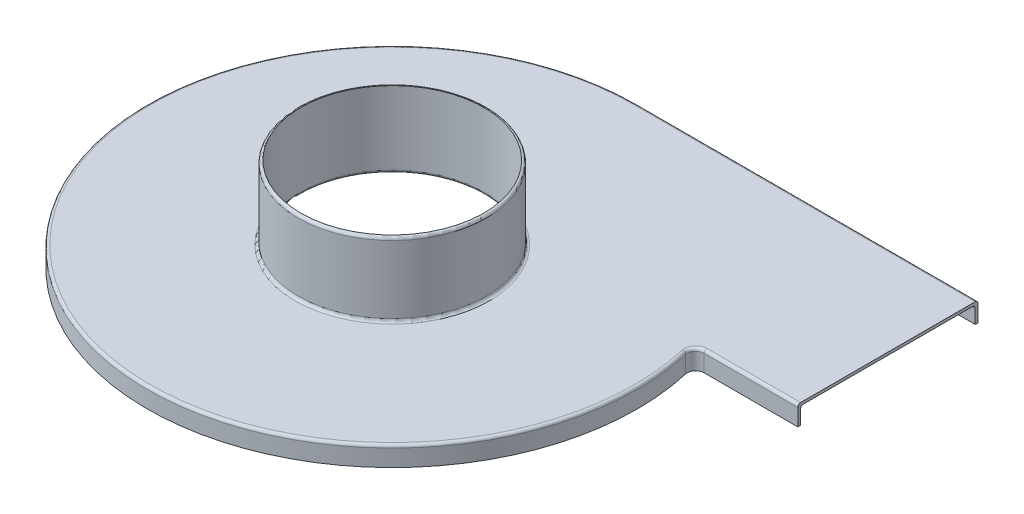
ISO-10303-21;
HEADER;
FILE_DESCRIPTION(('STEP AP214'),'2;1');
FILE_NAME('part.step','',(''),(''),'','','');
FILE_SCHEMA(('AUTOMOTIVE_DESIGN { 1 0 10303 214 1 1 1 1 }'));
ENDSEC;
DATA;
#1=APPLICATION_CONTEXT('core data for automotive mechanical design processes');
#2=APPLICATION_PROTOCOL_DEFINITION('international standard','automotive_design',2000,#1);
#3=PRODUCT_CONTEXT('',#1,'mechanical');
#4=PRODUCT('Part','Part','',(#3));
#5=PRODUCT_RELATED_PRODUCT_CATEGORY('part','',(#4));
#6=PRODUCT_DEFINITION_FORMATION('','',#4);
#7=PRODUCT_DEFINITION_CONTEXT('part definition',#1,'design');
#8=PRODUCT_DEFINITION('design','',#6,#7);
#9=PRODUCT_DEFINITION_SHAPE('','',#8);
#10=(LENGTH_UNIT() NAMED_UNIT(*) SI_UNIT(.MILLI.,.METRE.));
#11=(NAMED_UNIT(*) PLANE_ANGLE_UNIT() SI_UNIT($,.RADIAN.));
#12=(NAMED_UNIT(*) SI_UNIT($,.STERADIAN.) SOLID_ANGLE_UNIT());
#13=UNCERTAINTY_MEASURE_WITH_UNIT(LENGTH_MEASURE(1.E-05),#10,'distance_accuracy_value','');
#14=(GEOMETRIC_REPRESENTATION_CONTEXT(3) GLOBAL_UNCERTAINTY_ASSIGNED_CONTEXT((#13)) GLOBAL_UNIT_ASSIGNED_CONTEXT((#10,
#11,#12)) REPRESENTATION_CONTEXT('',''));
#15=CARTESIAN_POINT('',(0.,0.,0.));
#16=DIRECTION('',(0.,0.,1.));
#17=DIRECTION('',(1.,0.,0.));
#18=AXIS2_PLACEMENT_3D('',#15,#16,#17);
#19=CARTESIAN_POINT('',(121.,1.,0.));
#20=DIRECTION('',(1.,0.,0.));
#21=DIRECTION('',(0.,0.,-1.));
#22=AXIS2_PLACEMENT_3D('',#19,#20,#21);
#23=PLANE('',#22);
#24=DIRECTION('',(0.,-1.,0.));
#25=VECTOR('',#24,1.);
#26=CARTESIAN_POINT('',(121.,1.,-87.));
#27=LINE('',#26,#25);
#28=CARTESIAN_POINT('',(121.,0.,-87.));
#29=VERTEX_POINT('',#28);
#30=CARTESIAN_POINT('',(121.,-6.,-87.));
#31=VERTEX_POINT('',#30);
#32=EDGE_CURVE('E166',#29,#31,#27,.T.);
#33=ORIENTED_EDGE('',*,*,#32,.F.);
#34=CARTESIAN_POINT('',(121.,0.,-86.));
#35=DIRECTION('',(1.,0.,0.));
#36=DIRECTION('',(0.,0.,-1.));
#37=AXIS2_PLACEMENT_3D('',#34,#35,#36);
#38=CIRCLE('',#37,1.);
#39=CARTESIAN_POINT('',(121.,1.,-86.));
#40=VERTEX_POINT('',#39);
#41=EDGE_CURVE('E284',#29,#40,#38,.T.);
#42=ORIENTED_EDGE('',*,*,#41,.T.);
#43=DIRECTION('',(0.,0.,1.));
#44=VECTOR('',#43,1.);
#45=CARTESIAN_POINT('',(121.,1.,0.));
#46=LINE('',#45,#44);
#47=CARTESIAN_POINT('',(121.,1.,-24.));
#48=VERTEX_POINT('',#47);
#49=EDGE_CURVE('E235',#40,#48,#46,.T.);
#50=ORIENTED_EDGE('',*,*,#49,.T.);
#51=CARTESIAN_POINT('',(121.,0.,-24.));
#52=DIRECTION('',(1.,0.,0.));
#53=DIRECTION('',(0.,0.,-1.));
#54=AXIS2_PLACEMENT_3D('',#51,#52,#53);
#55=CIRCLE('',#54,1.);
#56=CARTESIAN_POINT('',(121.,0.,-23.));
#57=VERTEX_POINT('',#56);
#58=EDGE_CURVE('E281',#48,#57,#55,.T.);
#59=ORIENTED_EDGE('',*,*,#58,.T.);
#60=DIRECTION('',(0.,-1.,0.));
#61=VECTOR('',#60,1.);
#62=CARTESIAN_POINT('',(121.,1.,-23.));
#63=LINE('',#62,#61);
#64=CARTESIAN_POINT('',(121.,-6.,-23.));
#65=VERTEX_POINT('',#64);
#66=EDGE_CURVE('E239',#57,#65,#63,.T.);
#67=ORIENTED_EDGE('',*,*,#66,.T.);
#68=DIRECTION('',(0.,0.,1.));
#69=VECTOR('',#68,1.);
#70=CARTESIAN_POINT('',(121.,-6.,0.));
#71=LINE('',#70,#69);
#72=CARTESIAN_POINT('',(121.,-6.,-24.));
#73=VERTEX_POINT('',#72);
#74=EDGE_CURVE('E194',#73,#65,#71,.T.);
#75=ORIENTED_EDGE('',*,*,#74,.F.);
#76=DIRECTION('',(0.,1.,0.));
#77=VECTOR('',#76,1.);
#78=CARTESIAN_POINT('',(121.,-6.,-24.));
#79=LINE('',#78,#77);
#80=CARTESIAN_POINT('',(121.,-1.,-24.));
#81=VERTEX_POINT('',#80);
#82=EDGE_CURVE('E231',#73,#81,#79,.T.);
#83=ORIENTED_EDGE('',*,*,#82,.T.);
#84=CARTESIAN_POINT('',(121.,-1.,-25.));
#85=DIRECTION('',(1.,0.,0.));
#86=DIRECTION('',(0.,0.,-1.));
#87=AXIS2_PLACEMENT_3D('',#84,#85,#86);
#88=CIRCLE('',#87,1.);
#89=CARTESIAN_POINT('',(121.,0.,-25.));
#90=VERTEX_POINT('',#89);
#91=EDGE_CURVE('E11',#81,#90,#88,.F.);
#92=ORIENTED_EDGE('',*,*,#91,.T.);
#93=DIRECTION('',(0.,0.,1.));
#94=VECTOR('',#93,1.);
#95=CARTESIAN_POINT('',(121.,0.,0.));
#96=LINE('',#95,#94);
#97=CARTESIAN_POINT('',(121.,0.,-85.));
#98=VERTEX_POINT('',#97);
#99=EDGE_CURVE('E218',#98,#90,#96,.T.);
#100=ORIENTED_EDGE('',*,*,#99,.F.);
#101=CARTESIAN_POINT('',(121.,-1.,-85.));
#102=DIRECTION('',(1.,0.,0.));
#103=DIRECTION('',(0.,0.,-1.));
#104=AXIS2_PLACEMENT_3D('',#101,#102,#103);
#105=CIRCLE('',#104,1.);
#106=CARTESIAN_POINT('',(121.,-1.,-86.));
#107=VERTEX_POINT('',#106);
#108=EDGE_CURVE('E55',#98,#107,#105,.F.);
#109=ORIENTED_EDGE('',*,*,#108,.T.);
#110=DIRECTION('',(0.,1.,0.));
#111=VECTOR('',#110,1.);
#112=CARTESIAN_POINT('',(121.,-6.,-86.));
#113=LINE('',#112,#111);
#114=CARTESIAN_POINT('',(121.,-6.,-86.));
#115=VERTEX_POINT('',#114);
#116=EDGE_CURVE('E214',#115,#107,#113,.T.);
#117=ORIENTED_EDGE('',*,*,#116,.F.);
#118=EDGE_CURVE('E199',#31,#115,#71,.T.);
#119=ORIENTED_EDGE('',*,*,#118,.F.);
#120=EDGE_LOOP('',(#33,#42,#50,#59,#67,#75,#83,#92,#100,#109,#117,#119));
#121=FACE_BOUND('',#120,.T.);
#122=ADVANCED_FACE('F45',(#121),#23,.T.);
#123=CARTESIAN_POINT('',(0.,1.,-87.));
#124=DIRECTION('',(0.,0.,-1.));
#125=DIRECTION('',(-1.,0.,0.));
#126=AXIS2_PLACEMENT_3D('',#123,#124,#125);
#127=PLANE('',#126);
#128=DIRECTION('',(0.,-1.,0.));
#129=VECTOR('',#128,1.);
#130=CARTESIAN_POINT('',(0.,1.,-87.));
#131=LINE('',#130,#129);
#132=CARTESIAN_POINT('',(0.,0.,-87.));
#133=VERTEX_POINT('',#132);
#134=CARTESIAN_POINT('',(0.,-6.,-87.));
#135=VERTEX_POINT('',#134);
#136=EDGE_CURVE('E155',#133,#135,#131,.T.);
#137=ORIENTED_EDGE('',*,*,#136,.F.);
#138=DIRECTION('',(1.,0.,0.));
#139=VECTOR('',#138,1.);
#140=CARTESIAN_POINT('',(0.,0.,-87.));
#141=LINE('',#140,#139);
#142=EDGE_CURVE('E278',#133,#29,#141,.T.);
#143=ORIENTED_EDGE('',*,*,#142,.T.);
#144=ORIENTED_EDGE('',*,*,#32,.T.);
#145=DIRECTION('',(1.,0.,0.));
#146=VECTOR('',#145,1.);
#147=CARTESIAN_POINT('',(0.,-6.,-87.));
#148=LINE('',#147,#146);
#149=EDGE_CURVE('E170',#135,#31,#148,.T.);
#150=ORIENTED_EDGE('',*,*,#149,.F.);
#151=EDGE_LOOP('',(#137,#143,#144,#150));
#152=FACE_BOUND('',#151,.T.);
#153=ADVANCED_FACE('F171',(#152),#127,.T.);
#154=CARTESIAN_POINT('',(0.,1.,0.));
#155=DIRECTION('',(0.,-1.,0.));
#156=DIRECTION('',(0.,0.,-1.));
#157=AXIS2_PLACEMENT_3D('',#154,#155,#156);
#158=CYLINDRICAL_SURFACE('',#157,87.);
#159=DIRECTION('',(0.,-1.,0.));
#160=VECTOR('',#159,1.);
#161=CARTESIAN_POINT('',(84.8246557447905,1.,-19.3333333333333));
#162=LINE('',#161,#160);
#163=CARTESIAN_POINT('',(84.8246557447905,0.,-19.3333333333333));
#164=VERTEX_POINT('',#163);
#165=CARTESIAN_POINT('',(84.8246557447905,-6.,-19.3333333333333));
#166=VERTEX_POINT('',#165);
#167=EDGE_CURVE('E167',#164,#166,#162,.T.);
#168=ORIENTED_EDGE('',*,*,#167,.F.);
#169=CARTESIAN_POINT('',(0.,0.,0.));
#170=DIRECTION('',(0.,1.,0.));
#171=DIRECTION('',(0.,0.,1.));
#172=AXIS2_PLACEMENT_3D('',#169,#170,#171);
#173=CIRCLE('',#172,87.);
#174=EDGE_CURVE('E161',#164,#133,#173,.F.);
#175=ORIENTED_EDGE('',*,*,#174,.T.);
#176=ORIENTED_EDGE('',*,*,#136,.T.);
#177=CARTESIAN_POINT('',(0.,-6.,0.));
#178=DIRECTION('',(0.,1.,0.));
#179=DIRECTION('',(0.,0.,1.));
#180=AXIS2_PLACEMENT_3D('',#177,#178,#179);
#181=CIRCLE('',#180,87.);
#182=EDGE_CURVE('E159',#135,#166,#181,.T.);
#183=ORIENTED_EDGE('',*,*,#182,.T.);
#184=EDGE_LOOP('',(#168,#175,#176,#183));
#185=FACE_BOUND('',#184,.T.);
#186=ADVANCED_FACE('F157',(#185),#158,.T.);
#187=CARTESIAN_POINT('',(87.7496438739212,1.,-20.));
#188=DIRECTION('',(0.,-1.,0.));
#189=DIRECTION('',(0.,0.,-1.));
#190=AXIS2_PLACEMENT_3D('',#187,#188,#189);
#191=CYLINDRICAL_SURFACE('',#190,3.);
#192=DIRECTION('',(0.,-1.,0.));
#193=VECTOR('',#192,1.);
#194=CARTESIAN_POINT('',(87.7496438739212,1.,-23.));
#195=LINE('',#194,#193);
#196=CARTESIAN_POINT('',(87.7496438739212,0.,-23.));
#197=VERTEX_POINT('',#196);
#198=CARTESIAN_POINT('',(87.7496438739212,-6.,-23.));
#199=VERTEX_POINT('',#198);
#200=EDGE_CURVE('E245',#197,#199,#195,.T.);
#201=ORIENTED_EDGE('',*,*,#200,.F.);
#202=CARTESIAN_POINT('',(87.7496438739212,0.,-20.));
#203=DIRECTION('',(0.,1.,0.));
#204=DIRECTION('',(0.,0.,1.));
#205=AXIS2_PLACEMENT_3D('',#202,#203,#204);
#206=CIRCLE('',#205,3.);
#207=EDGE_CURVE('E63',#197,#164,#206,.T.);
#208=ORIENTED_EDGE('',*,*,#207,.T.);
#209=ORIENTED_EDGE('',*,*,#167,.T.);
#210=CARTESIAN_POINT('',(87.7496438739212,-6.,-20.));
#211=DIRECTION('',(0.,1.,0.));
#212=DIRECTION('',(0.,0.,1.));
#213=AXIS2_PLACEMENT_3D('',#210,#211,#212);
#214=CIRCLE('',#213,3.);
#215=EDGE_CURVE('E182',#199,#166,#214,.T.);
#216=ORIENTED_EDGE('',*,*,#215,.F.);
#217=EDGE_LOOP('',(#201,#208,#209,#216));
#218=FACE_BOUND('',#217,.T.);
#219=ADVANCED_FACE('F576',(#218),#191,.F.);
#220=CARTESIAN_POINT('',(0.,1.,-23.));
#221=DIRECTION('',(0.,0.,1.));
#222=DIRECTION('',(1.,0.,0.));
#223=AXIS2_PLACEMENT_3D('',#220,#221,#222);
#224=PLANE('',#223);
#225=ORIENTED_EDGE('',*,*,#66,.F.);
#226=DIRECTION('',(-1.,0.,0.));
#227=VECTOR('',#226,1.);
#228=CARTESIAN_POINT('',(0.,0.,-23.));
#229=LINE('',#228,#227);
#230=EDGE_CURVE('E71',#57,#197,#229,.T.);
#231=ORIENTED_EDGE('',*,*,#230,.T.);
#232=ORIENTED_EDGE('',*,*,#200,.T.);
#233=DIRECTION('',(-1.,0.,0.));
#234=VECTOR('',#233,1.);
#235=CARTESIAN_POINT('',(0.,-6.,-23.));
#236=LINE('',#235,#234);
#237=EDGE_CURVE('E188',#65,#199,#236,.T.);
#238=ORIENTED_EDGE('',*,*,#237,.F.);
#239=EDGE_LOOP('',(#225,#231,#232,#238));
#240=FACE_BOUND('',#239,.T.);
#241=ADVANCED_FACE('F570',(#240),#224,.T.);
#242=CARTESIAN_POINT('',(0.,1.,0.));
#243=DIRECTION('',(0.,1.,0.));
#244=DIRECTION('',(0.,0.,1.));
#245=AXIS2_PLACEMENT_3D('',#242,#243,#244);
#246=PLANE('',#245);
#247=ORIENTED_EDGE('',*,*,#49,.F.);
#248=DIRECTION('',(1.,0.,0.));
#249=VECTOR('',#248,1.);
#250=CARTESIAN_POINT('',(0.,1.,-86.));
#251=LINE('',#250,#249);
#252=CARTESIAN_POINT('',(0.,1.,-86.));
#253=VERTEX_POINT('',#252);
#254=EDGE_CURVE('E300',#40,#253,#251,.F.);
#255=ORIENTED_EDGE('',*,*,#254,.T.);
#256=CARTESIAN_POINT('',(0.,1.,0.));
#257=DIRECTION('',(0.,1.,0.));
#258=DIRECTION('',(0.,0.,1.));
#259=AXIS2_PLACEMENT_3D('',#256,#257,#258);
#260=CIRCLE('',#259,86.);
#261=CARTESIAN_POINT('',(83.8496597017469,1.,-19.1111111111111));
#262=VERTEX_POINT('',#261);
#263=EDGE_CURVE('E291',#253,#262,#260,.T.);
#264=ORIENTED_EDGE('',*,*,#263,.T.);
#265=CARTESIAN_POINT('',(87.7496438739212,1.,-20.));
#266=DIRECTION('',(0.,1.,0.));
#267=DIRECTION('',(0.,0.,1.));
#268=AXIS2_PLACEMENT_3D('',#265,#266,#267);
#269=CIRCLE('',#268,4.);
#270=CARTESIAN_POINT('',(87.7496438739212,1.,-24.));
#271=VERTEX_POINT('',#270);
#272=EDGE_CURVE('E294',#262,#271,#269,.F.);
#273=ORIENTED_EDGE('',*,*,#272,.T.);
#274=DIRECTION('',(-1.,0.,0.));
#275=VECTOR('',#274,1.);
#276=CARTESIAN_POINT('',(0.,1.,-24.));
#277=LINE('',#276,#275);
#278=EDGE_CURVE('E297',#271,#48,#277,.F.);
#279=ORIENTED_EDGE('',*,*,#278,.T.);
#280=EDGE_LOOP('',(#247,#255,#264,#273,#279));
#281=FACE_BOUND('',#280,.T.);
#282=CARTESIAN_POINT('',(0.,1.,0.));
#283=DIRECTION('',(0.,1.,0.));
#284=DIRECTION('',(0.,0.,1.));
#285=AXIS2_PLACEMENT_3D('',#282,#283,#284);
#286=CIRCLE('',#285,34.5);
#287=CARTESIAN_POINT('',(0.,1.,34.5));
#288=VERTEX_POINT('',#287);
#289=EDGE_CURVE('E287',#288,#288,#286,.F.);
#290=ORIENTED_EDGE('',*,*,#289,.T.);
#291=EDGE_LOOP('',(#290));
#292=FACE_BOUND('',#291,.T.);
#293=ADVANCED_FACE('F361',(#281,#292),#246,.T.);
#294=CARTESIAN_POINT('',(0.,0.,0.));
#295=DIRECTION('',(0.,1.,0.));
#296=DIRECTION('',(0.,0.,1.));
#297=AXIS2_PLACEMENT_3D('',#294,#295,#296);
#298=PLANE('',#297);
#299=CARTESIAN_POINT('',(0.,0.,0.));
#300=DIRECTION('',(0.,1.,0.));
#301=DIRECTION('',(0.,0.,1.));
#302=AXIS2_PLACEMENT_3D('',#299,#300,#301);
#303=CIRCLE('',#302,33.5);
#304=CARTESIAN_POINT('',(0.,0.,33.5));
#305=VERTEX_POINT('',#304);
#306=EDGE_CURVE('E252',#305,#305,#303,.T.);
#307=ORIENTED_EDGE('',*,*,#306,.T.);
#308=EDGE_LOOP('',(#307));
#309=FACE_BOUND('',#308,.T.);
#310=CARTESIAN_POINT('',(0.,0.,0.));
#311=DIRECTION('',(0.,1.,0.));
#312=DIRECTION('',(0.,0.,1.));
#313=AXIS2_PLACEMENT_3D('',#310,#311,#312);
#314=CIRCLE('',#313,85.);
#315=CARTESIAN_POINT('',(82.8746636587034,0.,-18.8888888888888));
#316=VERTEX_POINT('',#315);
#317=CARTESIAN_POINT('',(0.,0.,-85.));
#318=VERTEX_POINT('',#317);
#319=EDGE_CURVE('E256',#316,#318,#314,.F.);
#320=ORIENTED_EDGE('',*,*,#319,.T.);
#321=DIRECTION('',(1.,0.,0.));
#322=VECTOR('',#321,1.);
#323=CARTESIAN_POINT('',(0.,0.,-85.));
#324=LINE('',#323,#322);
#325=EDGE_CURVE('E265',#318,#98,#324,.T.);
#326=ORIENTED_EDGE('',*,*,#325,.T.);
#327=ORIENTED_EDGE('',*,*,#99,.T.);
#328=DIRECTION('',(-1.,0.,0.));
#329=VECTOR('',#328,1.);
#330=CARTESIAN_POINT('',(0.,0.,-25.));
#331=LINE('',#330,#329);
#332=CARTESIAN_POINT('',(87.7496438739212,0.,-25.));
#333=VERTEX_POINT('',#332);
#334=EDGE_CURVE('E262',#90,#333,#331,.T.);
#335=ORIENTED_EDGE('',*,*,#334,.T.);
#336=CARTESIAN_POINT('',(87.7496438739212,0.,-20.));
#337=DIRECTION('',(0.,1.,0.));
#338=DIRECTION('',(0.,0.,1.));
#339=AXIS2_PLACEMENT_3D('',#336,#337,#338);
#340=CIRCLE('',#339,5.00000000000001);
#341=EDGE_CURVE('E259',#333,#316,#340,.T.);
#342=ORIENTED_EDGE('',*,*,#341,.T.);
#343=EDGE_LOOP('',(#320,#326,#327,#335,#342));
#344=FACE_BOUND('',#343,.T.);
#345=ADVANCED_FACE('F415',(#309,#344),#298,.F.);
#346=CARTESIAN_POINT('',(0.,-6.,-86.));
#347=DIRECTION('',(0.,0.,1.));
#348=DIRECTION('',(1.,0.,0.));
#349=AXIS2_PLACEMENT_3D('',#346,#347,#348);
#350=PLANE('',#349);
#351=ORIENTED_EDGE('',*,*,#116,.T.);
#352=DIRECTION('',(1.,0.,0.));
#353=VECTOR('',#352,1.);
#354=CARTESIAN_POINT('',(0.,-1.,-86.));
#355=LINE('',#354,#353);
#356=CARTESIAN_POINT('',(0.,-1.,-86.));
#357=VERTEX_POINT('',#356);
#358=EDGE_CURVE('E269',#107,#357,#355,.F.);
#359=ORIENTED_EDGE('',*,*,#358,.T.);
#360=DIRECTION('',(0.,1.,0.));
#361=VECTOR('',#360,1.);
#362=CARTESIAN_POINT('',(0.,-6.,-86.));
#363=LINE('',#362,#361);
#364=CARTESIAN_POINT('',(0.,-6.,-86.));
#365=VERTEX_POINT('',#364);
#366=EDGE_CURVE('E219',#365,#357,#363,.T.);
#367=ORIENTED_EDGE('',*,*,#366,.F.);
#368=DIRECTION('',(1.,0.,0.));
#369=VECTOR('',#368,1.);
#370=CARTESIAN_POINT('',(0.,-6.,-86.));
#371=LINE('',#370,#369);
#372=EDGE_CURVE('E210',#365,#115,#371,.T.);
#373=ORIENTED_EDGE('',*,*,#372,.T.);
#374=EDGE_LOOP('',(#351,#359,#367,#373));
#375=FACE_BOUND('',#374,.T.);
#376=ADVANCED_FACE('F422',(#375),#350,.T.);
#377=CARTESIAN_POINT('',(0.,-6.,0.));
#378=DIRECTION('',(0.,1.,0.));
#379=DIRECTION('',(0.,0.,1.));
#380=AXIS2_PLACEMENT_3D('',#377,#378,#379);
#381=CYLINDRICAL_SURFACE('',#380,86.);
#382=ORIENTED_EDGE('',*,*,#366,.T.);
#383=CARTESIAN_POINT('',(0.,-1.,0.));
#384=DIRECTION('',(0.,1.,0.));
#385=DIRECTION('',(0.,0.,1.));
#386=AXIS2_PLACEMENT_3D('',#383,#384,#385);
#387=CIRCLE('',#386,86.);
#388=CARTESIAN_POINT('',(83.849659701747,-1.,-19.111111111111));
#389=VERTEX_POINT('',#388);
#390=EDGE_CURVE('E307',#357,#389,#387,.T.);
#391=ORIENTED_EDGE('',*,*,#390,.T.);
#392=DIRECTION('',(0.,1.,0.));
#393=VECTOR('',#392,1.);
#394=CARTESIAN_POINT('',(83.849659701747,-6.,-19.111111111111));
#395=LINE('',#394,#393);
#396=CARTESIAN_POINT('',(83.849659701747,-6.,-19.111111111111));
#397=VERTEX_POINT('',#396);
#398=EDGE_CURVE('E223',#397,#389,#395,.T.);
#399=ORIENTED_EDGE('',*,*,#398,.F.);
#400=CARTESIAN_POINT('',(0.,-6.,0.));
#401=DIRECTION('',(0.,1.,0.));
#402=DIRECTION('',(0.,0.,1.));
#403=AXIS2_PLACEMENT_3D('',#400,#401,#402);
#404=CIRCLE('',#403,86.);
#405=EDGE_CURVE('E207',#365,#397,#404,.T.);
#406=ORIENTED_EDGE('',*,*,#405,.F.);
#407=EDGE_LOOP('',(#382,#391,#399,#406));
#408=FACE_BOUND('',#407,.T.);
#409=ADVANCED_FACE('F557',(#408),#381,.F.);
#410=CARTESIAN_POINT('',(87.7496438739212,-6.,-20.));
#411=DIRECTION('',(0.,1.,0.));
#412=DIRECTION('',(0.,0.,1.));
#413=AXIS2_PLACEMENT_3D('',#410,#411,#412);
#414=CYLINDRICAL_SURFACE('',#413,4.00000000000001);
#415=ORIENTED_EDGE('',*,*,#398,.T.);
#416=CARTESIAN_POINT('',(87.7496438739212,-1.,-20.));
#417=DIRECTION('',(0.,1.,0.));
#418=DIRECTION('',(0.,0.,1.));
#419=AXIS2_PLACEMENT_3D('',#416,#417,#418);
#420=CIRCLE('',#419,4.00000000000001);
#421=CARTESIAN_POINT('',(87.7496438739212,-1.,-24.));
#422=VERTEX_POINT('',#421);
#423=EDGE_CURVE('E275',#389,#422,#420,.F.);
#424=ORIENTED_EDGE('',*,*,#423,.T.);
#425=DIRECTION('',(0.,1.,0.));
#426=VECTOR('',#425,1.);
#427=CARTESIAN_POINT('',(87.7496438739212,-6.,-24.));
#428=LINE('',#427,#426);
#429=CARTESIAN_POINT('',(87.7496438739212,-6.,-24.));
#430=VERTEX_POINT('',#429);
#431=EDGE_CURVE('E227',#430,#422,#428,.T.);
#432=ORIENTED_EDGE('',*,*,#431,.F.);
#433=CARTESIAN_POINT('',(87.7496438739212,-6.,-20.));
#434=DIRECTION('',(0.,1.,0.));
#435=DIRECTION('',(0.,0.,1.));
#436=AXIS2_PLACEMENT_3D('',#433,#434,#435);
#437=CIRCLE('',#436,4.00000000000001);
#438=EDGE_CURVE('E203',#430,#397,#437,.T.);
#439=ORIENTED_EDGE('',*,*,#438,.T.);
#440=EDGE_LOOP('',(#415,#424,#432,#439));
#441=FACE_BOUND('',#440,.T.);
#442=ADVANCED_FACE('F560',(#441),#414,.T.);
#443=CARTESIAN_POINT('',(0.,-6.,-24.));
#444=DIRECTION('',(0.,0.,-1.));
#445=DIRECTION('',(-1.,0.,0.));
#446=AXIS2_PLACEMENT_3D('',#443,#444,#445);
#447=PLANE('',#446);
#448=ORIENTED_EDGE('',*,*,#431,.T.);
#449=DIRECTION('',(-1.,0.,0.));
#450=VECTOR('',#449,1.);
#451=CARTESIAN_POINT('',(0.,-1.,-24.));
#452=LINE('',#451,#450);
#453=EDGE_CURVE('E272',#422,#81,#452,.F.);
#454=ORIENTED_EDGE('',*,*,#453,.T.);
#455=ORIENTED_EDGE('',*,*,#82,.F.);
#456=DIRECTION('',(-1.,0.,0.));
#457=VECTOR('',#456,1.);
#458=CARTESIAN_POINT('',(0.,-6.,-24.));
#459=LINE('',#458,#457);
#460=EDGE_CURVE('E198',#73,#430,#459,.T.);
#461=ORIENTED_EDGE('',*,*,#460,.T.);
#462=EDGE_LOOP('',(#448,#454,#455,#461));
#463=FACE_BOUND('',#462,.T.);
#464=ADVANCED_FACE('F552',(#463),#447,.T.);
#465=CARTESIAN_POINT('',(0.,-6.,0.));
#466=DIRECTION('',(0.,1.,0.));
#467=DIRECTION('',(0.,0.,1.));
#468=AXIS2_PLACEMENT_3D('',#465,#466,#467);
#469=PLANE('',#468);
#470=ORIENTED_EDGE('',*,*,#149,.T.);
#471=ORIENTED_EDGE('',*,*,#118,.T.);
#472=ORIENTED_EDGE('',*,*,#372,.F.);
#473=ORIENTED_EDGE('',*,*,#405,.T.);
#474=ORIENTED_EDGE('',*,*,#438,.F.);
#475=ORIENTED_EDGE('',*,*,#460,.F.);
#476=ORIENTED_EDGE('',*,*,#74,.T.);
#477=ORIENTED_EDGE('',*,*,#237,.T.);
#478=ORIENTED_EDGE('',*,*,#215,.T.);
#479=ORIENTED_EDGE('',*,*,#182,.F.);
#480=EDGE_LOOP('',(#470,#471,#472,#473,#474,#475,#476,#477,#478,#479));
#481=FACE_BOUND('',#480,.T.);
#482=ADVANCED_FACE('F179',(#481),#469,.F.);
#483=CARTESIAN_POINT('',(0.,27.,0.));
#484=DIRECTION('',(0.,-1.,0.));
#485=DIRECTION('',(0.,0.,-1.));
#486=AXIS2_PLACEMENT_3D('',#483,#484,#485);
#487=CYLINDRICAL_SURFACE('',#486,33.5);
#488=CARTESIAN_POINT('',(0.,2.,0.));
#489=DIRECTION('',(0.,1.,0.));
#490=DIRECTION('',(0.,0.,1.));
#491=AXIS2_PLACEMENT_3D('',#488,#489,#490);
#492=CIRCLE('',#491,33.5);
#493=CARTESIAN_POINT('',(0.,1.99999999999999,-33.5));
#494=VERTEX_POINT('',#493);
#495=EDGE_CURVE('E316',#494,#494,#492,.T.);
#496=CARTESIAN_POINT('',(0.,26.,0.));
#497=DIRECTION('',(0.,1.,0.));
#498=DIRECTION('',(0.,0.,1.));
#499=AXIS2_PLACEMENT_3D('',#496,#497,#498);
#500=CIRCLE('',#499,33.5);
#501=CARTESIAN_POINT('',(0.,26.,-33.5));
#502=VERTEX_POINT('',#501);
#503=EDGE_CURVE('E312',#502,#502,#500,.F.);
#504=CARTESIAN_POINT('',(0.,1.99999999999999,-33.5));
#505=CARTESIAN_POINT('',(0.,2.25,-33.5));
#506=CARTESIAN_POINT('',(0.,2.5,-33.5));
#507=CARTESIAN_POINT('',(0.,3.,-33.5));
#508=CARTESIAN_POINT('',(0.,3.25,-33.5));
#509=CARTESIAN_POINT('',(0.,3.75,-33.5));
#510=CARTESIAN_POINT('',(0.,4.,-33.5));
#511=CARTESIAN_POINT('',(0.,4.5,-33.5));
#512=CARTESIAN_POINT('',(0.,4.75,-33.5));
#513=CARTESIAN_POINT('',(0.,5.25,-33.5));
#514=CARTESIAN_POINT('',(0.,5.5,-33.5));
#515=CARTESIAN_POINT('',(0.,5.99999999999999,-33.5));
#516=CARTESIAN_POINT('',(0.,6.25,-33.5));
#517=CARTESIAN_POINT('',(0.,6.75,-33.5));
#518=CARTESIAN_POINT('',(0.,7.,-33.5));
#519=CARTESIAN_POINT('',(0.,7.5,-33.5));
#520=CARTESIAN_POINT('',(0.,7.75,-33.5));
#521=CARTESIAN_POINT('',(0.,8.25,-33.5));
#522=CARTESIAN_POINT('',(0.,8.5,-33.5));
#523=CARTESIAN_POINT('',(0.,9.,-33.5));
#524=CARTESIAN_POINT('',(0.,9.25,-33.5));
#525=CARTESIAN_POINT('',(0.,9.75,-33.5));
#526=CARTESIAN_POINT('',(0.,10.,-33.5));
#527=CARTESIAN_POINT('',(0.,10.5,-33.5));
#528=CARTESIAN_POINT('',(0.,10.75,-33.5));
#529=CARTESIAN_POINT('',(0.,11.25,-33.5));
#530=CARTESIAN_POINT('',(0.,11.5,-33.5));
#531=CARTESIAN_POINT('',(0.,12.,-33.5));
#532=CARTESIAN_POINT('',(0.,12.25,-33.5));
#533=CARTESIAN_POINT('',(0.,12.75,-33.5));
#534=CARTESIAN_POINT('',(0.,13.,-33.5));
#535=CARTESIAN_POINT('',(0.,13.5,-33.5));
#536=CARTESIAN_POINT('',(0.,13.75,-33.5));
#537=CARTESIAN_POINT('',(0.,14.25,-33.5));
#538=CARTESIAN_POINT('',(0.,14.5,-33.5));
#539=CARTESIAN_POINT('',(0.,15.,-33.5));
#540=CARTESIAN_POINT('',(0.,15.25,-33.5));
#541=CARTESIAN_POINT('',(0.,15.75,-33.5));
#542=CARTESIAN_POINT('',(0.,16.,-33.5));
#543=CARTESIAN_POINT('',(0.,16.5,-33.5));
#544=CARTESIAN_POINT('',(0.,16.75,-33.5));
#545=CARTESIAN_POINT('',(0.,17.25,-33.5));
#546=CARTESIAN_POINT('',(0.,17.5,-33.5));
#547=CARTESIAN_POINT('',(0.,18.,-33.5));
#548=CARTESIAN_POINT('',(0.,18.25,-33.5));
#549=CARTESIAN_POINT('',(0.,18.75,-33.5));
#550=CARTESIAN_POINT('',(0.,19.,-33.5));
#551=CARTESIAN_POINT('',(0.,19.5,-33.5));
#552=CARTESIAN_POINT('',(0.,19.75,-33.5));
#553=CARTESIAN_POINT('',(0.,20.25,-33.5));
#554=CARTESIAN_POINT('',(0.,20.5,-33.5));
#555=CARTESIAN_POINT('',(0.,21.,-33.5));
#556=CARTESIAN_POINT('',(0.,21.25,-33.5));
#557=CARTESIAN_POINT('',(0.,21.75,-33.5));
#558=CARTESIAN_POINT('',(0.,22.,-33.5));
#559=CARTESIAN_POINT('',(0.,22.5,-33.5));
#560=CARTESIAN_POINT('',(0.,22.75,-33.5));
#561=CARTESIAN_POINT('',(0.,23.25,-33.5));
#562=CARTESIAN_POINT('',(0.,23.5,-33.5));
#563=CARTESIAN_POINT('',(0.,24.,-33.5));
#564=CARTESIAN_POINT('',(0.,24.25,-33.5));
#565=CARTESIAN_POINT('',(0.,24.75,-33.5));
#566=CARTESIAN_POINT('',(0.,25.,-33.5));
#567=CARTESIAN_POINT('',(0.,25.5,-33.5));
#568=CARTESIAN_POINT('',(0.,25.75,-33.5));
#569=CARTESIAN_POINT('',(0.,26.,-33.5));
#570=B_SPLINE_CURVE_WITH_KNOTS('',3,(#504,#505,#506,#507,#508,#509,#510,#511,#512,#513,#514,
#515,#516,#517,#518,#519,#520,#521,#522,#523,#524,#525,#526,#527,#528,#529,#530,#531,#532,#533,
#534,#535,#536,#537,#538,#539,#540,#541,#542,#543,#544,#545,#546,#547,#548,#549,#550,#551,#552,
#553,#554,#555,#556,#557,#558,#559,#560,#561,#562,#563,#564,#565,#566,#567,#568,#569),
.UNSPECIFIED.,.F.,.F.,(4,2,2,2,2,2,2,2,2,2,2,2,2,2,2,2,2,2,2,2,2,2,2,2,2,2,2,2,2,2,2,2,4),(0.,
0.750000000000001,1.5,2.25,3.,3.75,4.5,5.25,6.,6.75,7.5,8.25,9.,9.75,10.5,11.25,12.,12.75,13.5,
14.25,15.,15.75,16.5,17.25,18.,18.75,19.5,20.25,21.,21.75,22.5,23.25,24.),.UNSPECIFIED.);
#571=EDGE_CURVE('BSEAM405',#494,#502,#570,.T.);
#572=ORIENTED_EDGE('',*,*,#495,.T.);
#573=ORIENTED_EDGE('',*,*,#503,.T.);
#574=ORIENTED_EDGE('',*,*,#571,.T.);
#575=ORIENTED_EDGE('',*,*,#571,.F.);
#576=EDGE_LOOP('',(#572,#574,#573,#575));
#577=FACE_BOUND('',#576,.T.);
#578=ADVANCED_FACE('F405',(#577),#487,.T.);
#579=CARTESIAN_POINT('',(0.,118.923881554251,0.));
#580=DIRECTION('',(0.,-1.,0.));
#581=DIRECTION('',(0.,0.,-1.));
#582=AXIS2_PLACEMENT_3D('',#579,#580,#581);
#583=CYLINDRICAL_SURFACE('',#582,32.5);
#584=CARTESIAN_POINT('',(0.,1.,0.));
#585=DIRECTION('',(0.,1.,0.));
#586=DIRECTION('',(0.,0.,1.));
#587=AXIS2_PLACEMENT_3D('',#584,#585,#586);
#588=CIRCLE('',#587,32.5);
#589=CARTESIAN_POINT('',(0.,1.,32.5));
#590=VERTEX_POINT('',#589);
#591=EDGE_CURVE('E320',#590,#590,#588,.F.);
#592=ORIENTED_EDGE('',*,*,#591,.T.);
#593=EDGE_LOOP('',(#592));
#594=FACE_BOUND('',#593,.T.);
#595=CARTESIAN_POINT('',(0.,27.,0.));
#596=DIRECTION('',(0.,1.,0.));
#597=DIRECTION('',(0.,0.,1.));
#598=AXIS2_PLACEMENT_3D('',#595,#596,#597);
#599=CIRCLE('',#598,32.5);
#600=CARTESIAN_POINT('',(0.,27.,32.5));
#601=VERTEX_POINT('',#600);
#602=EDGE_CURVE('E176',#601,#601,#599,.T.);
#603=ORIENTED_EDGE('',*,*,#602,.T.);
#604=EDGE_LOOP('',(#603));
#605=FACE_BOUND('',#604,.T.);
#606=ADVANCED_FACE('F400',(#594,#605),#583,.F.);
#607=CARTESIAN_POINT('',(0.,-1.,-25.));
#608=DIRECTION('',(-1.,0.,0.));
#609=DIRECTION('',(0.,0.,1.));
#610=AXIS2_PLACEMENT_3D('',#607,#608,#609);
#611=CYLINDRICAL_SURFACE('',#610,1.);
#612=ORIENTED_EDGE('',*,*,#91,.F.);
#613=ORIENTED_EDGE('',*,*,#453,.F.);
#614=CARTESIAN_POINT('',(87.7496438739212,-1.,-25.));
#615=DIRECTION('',(1.,0.,0.));
#616=DIRECTION('',(0.,0.,-1.));
#617=AXIS2_PLACEMENT_3D('',#614,#615,#616);
#618=CIRCLE('',#617,1.);
#619=EDGE_CURVE('E334',#333,#422,#618,.T.);
#620=ORIENTED_EDGE('',*,*,#619,.F.);
#621=ORIENTED_EDGE('',*,*,#334,.F.);
#622=EDGE_LOOP('',(#612,#613,#620,#621));
#623=FACE_BOUND('',#622,.T.);
#624=ADVANCED_FACE('F397',(#623),#611,.F.);
#625=CARTESIAN_POINT('',(87.7496438739212,-1.,-20.));
#626=DIRECTION('',(0.,1.,0.));
#627=DIRECTION('',(0.,0.,1.));
#628=AXIS2_PLACEMENT_3D('',#625,#626,#627);
#629=TOROIDAL_SURFACE('',#628,5.00000000000001,1.);
#630=ORIENTED_EDGE('',*,*,#619,.T.);
#631=ORIENTED_EDGE('',*,*,#423,.F.);
#632=CARTESIAN_POINT('',(82.8746636587034,-1.,-18.8888888888888));
#633=DIRECTION('',(-0.222222222222243,0.,-0.974996043043564));
#634=DIRECTION('',(-0.974996043043564,0.,0.222222222222243));
#635=AXIS2_PLACEMENT_3D('',#632,#633,#634);
#636=CIRCLE('',#635,1.);
#637=EDGE_CURVE('E330',#316,#389,#636,.T.);
#638=ORIENTED_EDGE('',*,*,#637,.F.);
#639=ORIENTED_EDGE('',*,*,#341,.F.);
#640=EDGE_LOOP('',(#630,#631,#638,#639));
#641=FACE_BOUND('',#640,.T.);
#642=ADVANCED_FACE('F393',(#641),#629,.F.);
#643=CARTESIAN_POINT('',(0.,-1.,0.));
#644=DIRECTION('',(0.,1.,0.));
#645=DIRECTION('',(0.,0.,1.));
#646=AXIS2_PLACEMENT_3D('',#643,#644,#645);
#647=TOROIDAL_SURFACE('',#646,85.,1.);
#648=ORIENTED_EDGE('',*,*,#637,.T.);
#649=ORIENTED_EDGE('',*,*,#390,.F.);
#650=CARTESIAN_POINT('',(0.,-1.,-85.));
#651=DIRECTION('',(-1.,0.,0.));
#652=DIRECTION('',(0.,0.,1.));
#653=AXIS2_PLACEMENT_3D('',#650,#651,#652);
#654=CIRCLE('',#653,1.);
#655=EDGE_CURVE('E326',#318,#357,#654,.T.);
#656=ORIENTED_EDGE('',*,*,#655,.F.);
#657=ORIENTED_EDGE('',*,*,#319,.F.);
#658=EDGE_LOOP('',(#648,#649,#656,#657));
#659=FACE_BOUND('',#658,.T.);
#660=ADVANCED_FACE('F389',(#659),#647,.F.);
#661=CARTESIAN_POINT('',(0.,-1.,-85.));
#662=DIRECTION('',(1.,0.,0.));
#663=DIRECTION('',(0.,0.,-1.));
#664=AXIS2_PLACEMENT_3D('',#661,#662,#663);
#665=CYLINDRICAL_SURFACE('',#664,1.);
#666=ORIENTED_EDGE('',*,*,#655,.T.);
#667=ORIENTED_EDGE('',*,*,#358,.F.);
#668=ORIENTED_EDGE('',*,*,#108,.F.);
#669=ORIENTED_EDGE('',*,*,#325,.F.);
#670=EDGE_LOOP('',(#666,#667,#668,#669));
#671=FACE_BOUND('',#670,.T.);
#672=ADVANCED_FACE('F386',(#671),#665,.F.);
#673=CARTESIAN_POINT('',(0.,0.,-24.));
#674=DIRECTION('',(-1.,0.,0.));
#675=DIRECTION('',(0.,0.,1.));
#676=AXIS2_PLACEMENT_3D('',#673,#674,#675);
#677=CYLINDRICAL_SURFACE('',#676,1.);
#678=ORIENTED_EDGE('',*,*,#58,.F.);
#679=ORIENTED_EDGE('',*,*,#278,.F.);
#680=CARTESIAN_POINT('',(87.7496438739212,0.,-24.));
#681=DIRECTION('',(-1.,0.,0.));
#682=DIRECTION('',(0.,0.,1.));
#683=AXIS2_PLACEMENT_3D('',#680,#681,#682);
#684=CIRCLE('',#683,1.);
#685=EDGE_CURVE('E49',#197,#271,#684,.T.);
#686=ORIENTED_EDGE('',*,*,#685,.F.);
#687=ORIENTED_EDGE('',*,*,#230,.F.);
#688=EDGE_LOOP('',(#678,#679,#686,#687));
#689=FACE_BOUND('',#688,.T.);
#690=ADVANCED_FACE('F358',(#689),#677,.T.);
#691=CARTESIAN_POINT('',(87.7496438739212,0.,-20.));
#692=DIRECTION('',(0.,1.,0.));
#693=DIRECTION('',(0.,0.,1.));
#694=AXIS2_PLACEMENT_3D('',#691,#692,#693);
#695=TOROIDAL_SURFACE('',#694,4.,1.);
#696=ORIENTED_EDGE('',*,*,#685,.T.);
#697=ORIENTED_EDGE('',*,*,#272,.F.);
#698=CARTESIAN_POINT('',(83.8496597017469,0.,-19.1111111111111));
#699=DIRECTION('',(0.222222222222223,0.,0.974996043043569));
#700=DIRECTION('',(0.974996043043569,0.,-0.222222222222223));
#701=AXIS2_PLACEMENT_3D('',#698,#699,#700);
#702=CIRCLE('',#701,1.);
#703=EDGE_CURVE('E341',#164,#262,#702,.T.);
#704=ORIENTED_EDGE('',*,*,#703,.F.);
#705=ORIENTED_EDGE('',*,*,#207,.F.);
#706=EDGE_LOOP('',(#696,#697,#704,#705));
#707=FACE_BOUND('',#706,.T.);
#708=ADVANCED_FACE('F354',(#707),#695,.T.);
#709=CARTESIAN_POINT('',(0.,0.,0.));
#710=DIRECTION('',(0.,1.,0.));
#711=DIRECTION('',(0.,0.,1.));
#712=AXIS2_PLACEMENT_3D('',#709,#710,#711);
#713=TOROIDAL_SURFACE('',#712,86.,1.);
#714=ORIENTED_EDGE('',*,*,#703,.T.);
#715=ORIENTED_EDGE('',*,*,#263,.F.);
#716=CARTESIAN_POINT('',(0.,0.,-86.));
#717=DIRECTION('',(1.,0.,0.));
#718=DIRECTION('',(0.,1.,0.));
#719=AXIS2_PLACEMENT_3D('',#716,#717,#718);
#720=CIRCLE('',#719,1.);
#721=EDGE_CURVE('E338',#133,#253,#720,.T.);
#722=ORIENTED_EDGE('',*,*,#721,.F.);
#723=ORIENTED_EDGE('',*,*,#174,.F.);
#724=EDGE_LOOP('',(#714,#715,#722,#723));
#725=FACE_BOUND('',#724,.T.);
#726=ADVANCED_FACE('F368',(#725),#713,.T.);
#727=CARTESIAN_POINT('',(0.,0.,-86.));
#728=DIRECTION('',(1.,0.,0.));
#729=DIRECTION('',(0.,0.,-1.));
#730=AXIS2_PLACEMENT_3D('',#727,#728,#729);
#731=CYLINDRICAL_SURFACE('',#730,1.);
#732=ORIENTED_EDGE('',*,*,#721,.T.);
#733=ORIENTED_EDGE('',*,*,#254,.F.);
#734=ORIENTED_EDGE('',*,*,#41,.F.);
#735=ORIENTED_EDGE('',*,*,#142,.F.);
#736=EDGE_LOOP('',(#732,#733,#734,#735));
#737=FACE_BOUND('',#736,.T.);
#738=ADVANCED_FACE('F367',(#737),#731,.T.);
#739=CARTESIAN_POINT('',(0.,2.,0.));
#740=DIRECTION('',(0.,1.,0.));
#741=DIRECTION('',(0.,0.,1.));
#742=AXIS2_PLACEMENT_3D('',#739,#740,#741);
#743=TOROIDAL_SURFACE('',#742,34.5,1.);
#744=ORIENTED_EDGE('',*,*,#289,.F.);
#745=EDGE_LOOP('',(#744));
#746=FACE_BOUND('',#745,.T.);
#747=ORIENTED_EDGE('',*,*,#495,.F.);
#748=EDGE_LOOP('',(#747));
#749=FACE_BOUND('',#748,.T.);
#750=ADVANCED_FACE('F375',(#746,#749),#743,.F.);
#751=CARTESIAN_POINT('',(0.,1.,0.));
#752=DIRECTION('',(0.,1.,0.));
#753=DIRECTION('',(0.,0.,1.));
#754=AXIS2_PLACEMENT_3D('',#751,#752,#753);
#755=TOROIDAL_SURFACE('',#754,33.5,1.);
#756=ORIENTED_EDGE('',*,*,#591,.F.);
#757=EDGE_LOOP('',(#756));
#758=FACE_BOUND('',#757,.T.);
#759=ORIENTED_EDGE('',*,*,#306,.F.);
#760=EDGE_LOOP('',(#759));
#761=FACE_BOUND('',#760,.T.);
#762=ADVANCED_FACE('F538',(#758,#761),#755,.T.);
#763=CARTESIAN_POINT('',(0.,26.,0.));
#764=DIRECTION('',(0.,1.,0.));
#765=DIRECTION('',(0.,0.,1.));
#766=AXIS2_PLACEMENT_3D('',#763,#764,#765);
#767=TOROIDAL_SURFACE('',#766,32.5,1.);
#768=ORIENTED_EDGE('',*,*,#503,.F.);
#769=EDGE_LOOP('',(#768));
#770=FACE_BOUND('',#769,.T.);
#771=ORIENTED_EDGE('',*,*,#602,.F.);
#772=EDGE_LOOP('',(#771));
#773=FACE_BOUND('',#772,.T.);
#774=ADVANCED_FACE('F47',(#770,#773),#767,.T.);
#775=CLOSED_SHELL('',(#122,#153,#186,#219,#241,#293,#345,#376,#409,#442,#464,#482,#578,#606,
#624,#642,#660,#672,#690,#708,#726,#738,#750,#762,#774));
#776=MANIFOLD_SOLID_BREP('B2',#775);
#777=ADVANCED_BREP_SHAPE_REPRESENTATION('',(#18,#776),#14);
#778=SHAPE_DEFINITION_REPRESENTATION(#9,#777);
ENDSEC;
END-ISO-10303-21;
